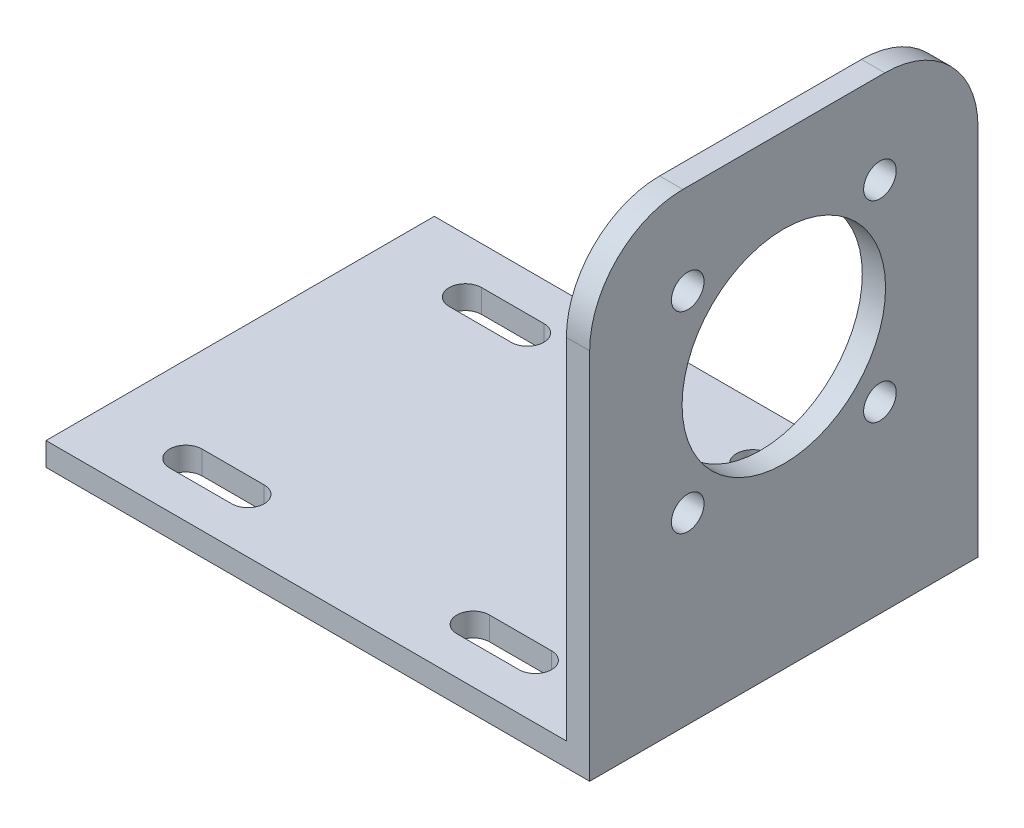
ISO-10303-21;
HEADER;
FILE_DESCRIPTION(('STEP AP214'),'2;1');
FILE_NAME('part.step','',(''),(''),'','','');
FILE_SCHEMA(('AUTOMOTIVE_DESIGN { 1 0 10303 214 1 1 1 1 }'));
ENDSEC;
DATA;
#1=APPLICATION_CONTEXT('core data for automotive mechanical design processes');
#2=APPLICATION_PROTOCOL_DEFINITION('international standard','automotive_design',2000,#1);
#3=PRODUCT_CONTEXT('',#1,'mechanical');
#4=PRODUCT('Part','Part','',(#3));
#5=PRODUCT_RELATED_PRODUCT_CATEGORY('part','',(#4));
#6=PRODUCT_DEFINITION_FORMATION('','',#4);
#7=PRODUCT_DEFINITION_CONTEXT('part definition',#1,'design');
#8=PRODUCT_DEFINITION('design','',#6,#7);
#9=PRODUCT_DEFINITION_SHAPE('','',#8);
#10=(LENGTH_UNIT() NAMED_UNIT(*) SI_UNIT(.MILLI.,.METRE.));
#11=(NAMED_UNIT(*) PLANE_ANGLE_UNIT() SI_UNIT($,.RADIAN.));
#12=(NAMED_UNIT(*) SI_UNIT($,.STERADIAN.) SOLID_ANGLE_UNIT());
#13=UNCERTAINTY_MEASURE_WITH_UNIT(LENGTH_MEASURE(1.E-05),#10,'distance_accuracy_value','');
#14=(GEOMETRIC_REPRESENTATION_CONTEXT(3) GLOBAL_UNCERTAINTY_ASSIGNED_CONTEXT((#13)) GLOBAL_UNIT_ASSIGNED_CONTEXT((#10,
#11,#12)) REPRESENTATION_CONTEXT('',''));
#15=CARTESIAN_POINT('',(0.,0.,0.));
#16=DIRECTION('',(0.,0.,1.));
#17=DIRECTION('',(1.,0.,0.));
#18=AXIS2_PLACEMENT_3D('',#15,#16,#17);
#19=CARTESIAN_POINT('',(0.,-3.,25.));
#20=DIRECTION('',(1.,0.,0.));
#21=DIRECTION('',(0.,0.,-1.));
#22=AXIS2_PLACEMENT_3D('',#19,#20,#21);
#23=PLANE('',#22);
#24=DIRECTION('',(0.,-1.,0.));
#25=VECTOR('',#24,1.);
#26=CARTESIAN_POINT('',(0.,-3.,-25.));
#27=LINE('',#26,#25);
#28=CARTESIAN_POINT('',(0.,0.,-25.));
#29=VERTEX_POINT('',#28);
#30=CARTESIAN_POINT('',(0.,-3.,-25.));
#31=VERTEX_POINT('',#30);
#32=EDGE_CURVE('E336',#29,#31,#27,.T.);
#33=ORIENTED_EDGE('',*,*,#32,.T.);
#34=DIRECTION('',(0.,0.,-1.));
#35=VECTOR('',#34,1.);
#36=CARTESIAN_POINT('',(0.,-3.,25.));
#37=LINE('',#36,#35);
#38=CARTESIAN_POINT('',(0.,-3.,25.));
#39=VERTEX_POINT('',#38);
#40=EDGE_CURVE('E373',#39,#31,#37,.T.);
#41=ORIENTED_EDGE('',*,*,#40,.F.);
#42=DIRECTION('',(0.,-1.,0.));
#43=VECTOR('',#42,1.);
#44=CARTESIAN_POINT('',(0.,-3.,25.));
#45=LINE('',#44,#43);
#46=CARTESIAN_POINT('',(0.,0.,25.));
#47=VERTEX_POINT('',#46);
#48=EDGE_CURVE('E337',#47,#39,#45,.T.);
#49=ORIENTED_EDGE('',*,*,#48,.F.);
#50=DIRECTION('',(0.,0.,-1.));
#51=VECTOR('',#50,1.);
#52=CARTESIAN_POINT('',(0.,0.,25.));
#53=LINE('',#52,#51);
#54=EDGE_CURVE('E349',#47,#29,#53,.T.);
#55=ORIENTED_EDGE('',*,*,#54,.T.);
#56=EDGE_LOOP('',(#33,#41,#49,#55));
#57=FACE_BOUND('',#56,.T.);
#58=ADVANCED_FACE('F35',(#57),#23,.F.);
#59=CARTESIAN_POINT('',(70.,-2.99999999999999,25.));
#60=DIRECTION('',(0.,1.,0.));
#61=DIRECTION('',(-1.,0.,0.));
#62=AXIS2_PLACEMENT_3D('',#59,#60,#61);
#63=PLANE('',#62);
#64=DIRECTION('',(1.,0.,0.));
#65=VECTOR('',#64,1.);
#66=CARTESIAN_POINT('',(48.,-2.99999999999999,-20.1));
#67=LINE('',#66,#65);
#68=CARTESIAN_POINT('',(48.,-2.99999999999999,-20.1));
#69=VERTEX_POINT('',#68);
#70=CARTESIAN_POINT('',(56.,-2.99999999999999,-20.1));
#71=VERTEX_POINT('',#70);
#72=EDGE_CURVE('E246',#69,#71,#67,.T.);
#73=ORIENTED_EDGE('',*,*,#72,.F.);
#74=CARTESIAN_POINT('',(48.,-2.99999999999999,-18.));
#75=DIRECTION('',(0.,1.,0.));
#76=DIRECTION('',(-1.,0.,0.));
#77=AXIS2_PLACEMENT_3D('',#74,#75,#76);
#78=CIRCLE('',#77,2.1);
#79=CARTESIAN_POINT('',(48.,-2.99999999999999,-15.9));
#80=VERTEX_POINT('',#79);
#81=EDGE_CURVE('E250',#80,#69,#78,.F.);
#82=ORIENTED_EDGE('',*,*,#81,.F.);
#83=DIRECTION('',(-1.,0.,0.));
#84=VECTOR('',#83,1.);
#85=CARTESIAN_POINT('',(48.,-2.99999999999999,-15.9));
#86=LINE('',#85,#84);
#87=CARTESIAN_POINT('',(56.,-2.99999999999999,-15.9));
#88=VERTEX_POINT('',#87);
#89=EDGE_CURVE('E267',#88,#80,#86,.T.);
#90=ORIENTED_EDGE('',*,*,#89,.F.);
#91=CARTESIAN_POINT('',(56.,-2.99999999999999,-18.));
#92=DIRECTION('',(0.,1.,0.));
#93=DIRECTION('',(-1.,0.,0.));
#94=AXIS2_PLACEMENT_3D('',#91,#92,#93);
#95=CIRCLE('',#94,2.1);
#96=EDGE_CURVE('E244',#71,#88,#95,.F.);
#97=ORIENTED_EDGE('',*,*,#96,.F.);
#98=EDGE_LOOP('',(#73,#82,#90,#97));
#99=FACE_BOUND('',#98,.T.);
#100=DIRECTION('',(1.,0.,0.));
#101=VECTOR('',#100,1.);
#102=CARTESIAN_POINT('',(11.,-3.,15.9));
#103=LINE('',#102,#101);
#104=CARTESIAN_POINT('',(11.,-3.,15.9));
#105=VERTEX_POINT('',#104);
#106=CARTESIAN_POINT('',(19.,-3.,15.9));
#107=VERTEX_POINT('',#106);
#108=EDGE_CURVE('E278',#105,#107,#103,.T.);
#109=ORIENTED_EDGE('',*,*,#108,.F.);
#110=CARTESIAN_POINT('',(11.,-3.,18.));
#111=DIRECTION('',(0.,1.,0.));
#112=DIRECTION('',(-1.,0.,0.));
#113=AXIS2_PLACEMENT_3D('',#110,#111,#112);
#114=CIRCLE('',#113,2.09999999999999);
#115=CARTESIAN_POINT('',(11.,-3.,20.1));
#116=VERTEX_POINT('',#115);
#117=EDGE_CURVE('E281',#116,#105,#114,.F.);
#118=ORIENTED_EDGE('',*,*,#117,.F.);
#119=DIRECTION('',(-1.,0.,0.));
#120=VECTOR('',#119,1.);
#121=CARTESIAN_POINT('',(11.,-3.,20.1));
#122=LINE('',#121,#120);
#123=CARTESIAN_POINT('',(19.,-3.,20.1));
#124=VERTEX_POINT('',#123);
#125=EDGE_CURVE('E247',#124,#116,#122,.T.);
#126=ORIENTED_EDGE('',*,*,#125,.F.);
#127=CARTESIAN_POINT('',(19.,-3.,18.));
#128=DIRECTION('',(0.,1.,0.));
#129=DIRECTION('',(-1.,0.,0.));
#130=AXIS2_PLACEMENT_3D('',#127,#128,#129);
#131=CIRCLE('',#130,2.09999999999999);
#132=EDGE_CURVE('E220',#107,#124,#131,.F.);
#133=ORIENTED_EDGE('',*,*,#132,.F.);
#134=EDGE_LOOP('',(#109,#118,#126,#133));
#135=FACE_BOUND('',#134,.T.);
#136=DIRECTION('',(1.,0.,0.));
#137=VECTOR('',#136,1.);
#138=CARTESIAN_POINT('',(48.,-2.99999999999999,15.9));
#139=LINE('',#138,#137);
#140=CARTESIAN_POINT('',(48.,-2.99999999999999,15.9));
#141=VERTEX_POINT('',#140);
#142=CARTESIAN_POINT('',(56.,-2.99999999999999,15.9));
#143=VERTEX_POINT('',#142);
#144=EDGE_CURVE('E226',#141,#143,#139,.T.);
#145=ORIENTED_EDGE('',*,*,#144,.F.);
#146=CARTESIAN_POINT('',(48.,-2.99999999999999,18.));
#147=DIRECTION('',(0.,1.,0.));
#148=DIRECTION('',(-1.,0.,0.));
#149=AXIS2_PLACEMENT_3D('',#146,#147,#148);
#150=CIRCLE('',#149,2.1);
#151=CARTESIAN_POINT('',(48.,-2.99999999999999,20.1));
#152=VERTEX_POINT('',#151);
#153=EDGE_CURVE('E204',#152,#141,#150,.F.);
#154=ORIENTED_EDGE('',*,*,#153,.F.);
#155=DIRECTION('',(-1.,0.,0.));
#156=VECTOR('',#155,1.);
#157=CARTESIAN_POINT('',(48.,-2.99999999999999,20.1));
#158=LINE('',#157,#156);
#159=CARTESIAN_POINT('',(56.,-2.99999999999999,20.1));
#160=VERTEX_POINT('',#159);
#161=EDGE_CURVE('E216',#160,#152,#158,.T.);
#162=ORIENTED_EDGE('',*,*,#161,.F.);
#163=CARTESIAN_POINT('',(56.,-2.99999999999999,18.));
#164=DIRECTION('',(0.,1.,0.));
#165=DIRECTION('',(-1.,0.,0.));
#166=AXIS2_PLACEMENT_3D('',#163,#164,#165);
#167=CIRCLE('',#166,2.1);
#168=EDGE_CURVE('E230',#143,#160,#167,.F.);
#169=ORIENTED_EDGE('',*,*,#168,.F.);
#170=EDGE_LOOP('',(#145,#154,#162,#169));
#171=FACE_BOUND('',#170,.T.);
#172=DIRECTION('',(1.,0.,0.));
#173=VECTOR('',#172,1.);
#174=CARTESIAN_POINT('',(11.,-3.,-20.1));
#175=LINE('',#174,#173);
#176=CARTESIAN_POINT('',(11.,-3.,-20.1));
#177=VERTEX_POINT('',#176);
#178=CARTESIAN_POINT('',(19.,-3.,-20.1));
#179=VERTEX_POINT('',#178);
#180=EDGE_CURVE('E307',#177,#179,#175,.T.);
#181=ORIENTED_EDGE('',*,*,#180,.F.);
#182=CARTESIAN_POINT('',(11.,-3.,-18.));
#183=DIRECTION('',(0.,1.,0.));
#184=DIRECTION('',(-1.,0.,0.));
#185=AXIS2_PLACEMENT_3D('',#182,#183,#184);
#186=CIRCLE('',#185,2.09999999999999);
#187=CARTESIAN_POINT('',(11.,-3.,-15.9));
#188=VERTEX_POINT('',#187);
#189=EDGE_CURVE('E310',#188,#177,#186,.F.);
#190=ORIENTED_EDGE('',*,*,#189,.F.);
#191=DIRECTION('',(-1.,0.,0.));
#192=VECTOR('',#191,1.);
#193=CARTESIAN_POINT('',(11.,-3.,-15.9));
#194=LINE('',#193,#192);
#195=CARTESIAN_POINT('',(19.,-3.,-15.9));
#196=VERTEX_POINT('',#195);
#197=EDGE_CURVE('E327',#196,#188,#194,.T.);
#198=ORIENTED_EDGE('',*,*,#197,.F.);
#199=CARTESIAN_POINT('',(19.,-3.,-18.));
#200=DIRECTION('',(0.,1.,0.));
#201=DIRECTION('',(-1.,0.,0.));
#202=AXIS2_PLACEMENT_3D('',#199,#200,#201);
#203=CIRCLE('',#202,2.09999999999999);
#204=EDGE_CURVE('E276',#179,#196,#203,.F.);
#205=ORIENTED_EDGE('',*,*,#204,.F.);
#206=EDGE_LOOP('',(#181,#190,#198,#205));
#207=FACE_BOUND('',#206,.T.);
#208=DIRECTION('',(1.,0.,0.));
#209=VECTOR('',#208,1.);
#210=CARTESIAN_POINT('',(70.,-2.99999999999999,-25.));
#211=LINE('',#210,#209);
#212=CARTESIAN_POINT('',(70.,-2.99999999999999,-25.));
#213=VERTEX_POINT('',#212);
#214=EDGE_CURVE('E352',#31,#213,#211,.T.);
#215=ORIENTED_EDGE('',*,*,#214,.T.);
#216=DIRECTION('',(0.,0.,-1.));
#217=VECTOR('',#216,1.);
#218=CARTESIAN_POINT('',(70.,-2.99999999999999,25.));
#219=LINE('',#218,#217);
#220=CARTESIAN_POINT('',(70.,-2.99999999999999,25.));
#221=VERTEX_POINT('',#220);
#222=EDGE_CURVE('E370',#221,#213,#219,.T.);
#223=ORIENTED_EDGE('',*,*,#222,.F.);
#224=DIRECTION('',(1.,0.,0.));
#225=VECTOR('',#224,1.);
#226=CARTESIAN_POINT('',(70.,-2.99999999999999,25.));
#227=LINE('',#226,#225);
#228=EDGE_CURVE('E340',#39,#221,#227,.T.);
#229=ORIENTED_EDGE('',*,*,#228,.F.);
#230=ORIENTED_EDGE('',*,*,#40,.T.);
#231=EDGE_LOOP('',(#215,#223,#229,#230));
#232=FACE_BOUND('',#231,.T.);
#233=ADVANCED_FACE('F223',(#99,#135,#171,#207,#232),#63,.F.);
#234=CARTESIAN_POINT('',(70.,57.,25.));
#235=DIRECTION('',(-1.,0.,0.));
#236=DIRECTION('',(0.,-1.,0.));
#237=AXIS2_PLACEMENT_3D('',#234,#235,#236);
#238=PLANE('',#237);
#239=CARTESIAN_POINT('',(70.,45.3743686707644,12.3743686707644));
#240=DIRECTION('',(-1.,0.,0.));
#241=DIRECTION('',(0.,-1.,0.));
#242=AXIS2_PLACEMENT_3D('',#239,#240,#241);
#243=CIRCLE('',#242,2.1);
#244=CARTESIAN_POINT('',(70.,43.2743686707644,12.3743686707644));
#245=VERTEX_POINT('',#244);
#246=EDGE_CURVE('E547',#245,#245,#243,.T.);
#247=ORIENTED_EDGE('',*,*,#246,.T.);
#248=EDGE_LOOP('',(#247));
#249=FACE_BOUND('',#248,.T.);
#250=CARTESIAN_POINT('',(70.,20.6256313292352,12.3743686707644));
#251=DIRECTION('',(-1.,0.,0.));
#252=DIRECTION('',(0.,-1.,0.));
#253=AXIS2_PLACEMENT_3D('',#250,#251,#252);
#254=CIRCLE('',#253,2.1);
#255=CARTESIAN_POINT('',(70.,18.5256313292352,12.3743686707644));
#256=VERTEX_POINT('',#255);
#257=EDGE_CURVE('E541',#256,#256,#254,.T.);
#258=ORIENTED_EDGE('',*,*,#257,.T.);
#259=EDGE_LOOP('',(#258));
#260=FACE_BOUND('',#259,.T.);
#261=CARTESIAN_POINT('',(70.,20.6256313292352,-12.3743686707648));
#262=DIRECTION('',(-1.,0.,0.));
#263=DIRECTION('',(0.,-1.,0.));
#264=AXIS2_PLACEMENT_3D('',#261,#262,#263);
#265=CIRCLE('',#264,2.1);
#266=CARTESIAN_POINT('',(70.,18.5256313292352,-12.3743686707648));
#267=VERTEX_POINT('',#266);
#268=EDGE_CURVE('E535',#267,#267,#265,.T.);
#269=ORIENTED_EDGE('',*,*,#268,.T.);
#270=EDGE_LOOP('',(#269));
#271=FACE_BOUND('',#270,.T.);
#272=CARTESIAN_POINT('',(70.,45.3743686707644,-12.3743686707647));
#273=DIRECTION('',(-1.,0.,0.));
#274=DIRECTION('',(0.,-1.,0.));
#275=AXIS2_PLACEMENT_3D('',#272,#273,#274);
#276=CIRCLE('',#275,2.1);
#277=CARTESIAN_POINT('',(70.,43.2743686707644,-12.3743686707647));
#278=VERTEX_POINT('',#277);
#279=EDGE_CURVE('E528',#278,#278,#276,.T.);
#280=ORIENTED_EDGE('',*,*,#279,.T.);
#281=EDGE_LOOP('',(#280));
#282=FACE_BOUND('',#281,.T.);
#283=CARTESIAN_POINT('',(70.,33.,0.));
#284=DIRECTION('',(-1.,0.,0.));
#285=DIRECTION('',(0.,-1.,0.));
#286=AXIS2_PLACEMENT_3D('',#283,#284,#285);
#287=CIRCLE('',#286,13.1);
#288=CARTESIAN_POINT('',(70.,19.9,0.));
#289=VERTEX_POINT('',#288);
#290=EDGE_CURVE('E533',#289,#289,#287,.T.);
#291=ORIENTED_EDGE('',*,*,#290,.T.);
#292=EDGE_LOOP('',(#291));
#293=FACE_BOUND('',#292,.T.);
#294=DIRECTION('',(0.,1.,0.));
#295=VECTOR('',#294,1.);
#296=CARTESIAN_POINT('',(70.,57.,-25.));
#297=LINE('',#296,#295);
#298=CARTESIAN_POINT('',(70.,45.,-25.));
#299=VERTEX_POINT('',#298);
#300=EDGE_CURVE('E354',#213,#299,#297,.T.);
#301=ORIENTED_EDGE('',*,*,#300,.T.);
#302=CARTESIAN_POINT('',(70.,45.,-13.));
#303=DIRECTION('',(-1.,0.,0.));
#304=DIRECTION('',(0.,-1.,0.));
#305=AXIS2_PLACEMENT_3D('',#302,#303,#304);
#306=CIRCLE('',#305,12.);
#307=CARTESIAN_POINT('',(70.,57.,-13.));
#308=VERTEX_POINT('',#307);
#309=EDGE_CURVE('E43',#299,#308,#306,.F.);
#310=ORIENTED_EDGE('',*,*,#309,.T.);
#311=DIRECTION('',(0.,0.,-1.));
#312=VECTOR('',#311,1.);
#313=CARTESIAN_POINT('',(70.,57.,25.));
#314=LINE('',#313,#312);
#315=CARTESIAN_POINT('',(70.,57.,13.));
#316=VERTEX_POINT('',#315);
#317=EDGE_CURVE('E367',#316,#308,#314,.T.);
#318=ORIENTED_EDGE('',*,*,#317,.F.);
#319=CARTESIAN_POINT('',(70.,45.,13.));
#320=DIRECTION('',(-1.,0.,0.));
#321=DIRECTION('',(0.,-1.,0.));
#322=AXIS2_PLACEMENT_3D('',#319,#320,#321);
#323=CIRCLE('',#322,12.);
#324=CARTESIAN_POINT('',(70.,45.,25.));
#325=VERTEX_POINT('',#324);
#326=EDGE_CURVE('E50',#316,#325,#323,.F.);
#327=ORIENTED_EDGE('',*,*,#326,.T.);
#328=DIRECTION('',(0.,1.,0.));
#329=VECTOR('',#328,1.);
#330=CARTESIAN_POINT('',(70.,57.,25.));
#331=LINE('',#330,#329);
#332=EDGE_CURVE('E343',#221,#325,#331,.T.);
#333=ORIENTED_EDGE('',*,*,#332,.F.);
#334=ORIENTED_EDGE('',*,*,#222,.T.);
#335=EDGE_LOOP('',(#301,#310,#318,#327,#333,#334));
#336=FACE_BOUND('',#335,.T.);
#337=ADVANCED_FACE('F387',(#249,#260,#271,#282,#293,#336),#238,.F.);
#338=CARTESIAN_POINT('',(67.,57.,25.));
#339=DIRECTION('',(0.,-1.,0.));
#340=DIRECTION('',(0.,0.,-1.));
#341=AXIS2_PLACEMENT_3D('',#338,#339,#340);
#342=PLANE('',#341);
#343=ORIENTED_EDGE('',*,*,#317,.T.);
#344=DIRECTION('',(-1.,0.,0.));
#345=VECTOR('',#344,1.);
#346=CARTESIAN_POINT('',(67.,57.,-13.));
#347=LINE('',#346,#345);
#348=CARTESIAN_POINT('',(67.,57.,-13.));
#349=VERTEX_POINT('',#348);
#350=EDGE_CURVE('E378',#308,#349,#347,.T.);
#351=ORIENTED_EDGE('',*,*,#350,.T.);
#352=DIRECTION('',(0.,0.,-1.));
#353=VECTOR('',#352,1.);
#354=CARTESIAN_POINT('',(67.,57.,25.));
#355=LINE('',#354,#353);
#356=CARTESIAN_POINT('',(67.,57.,13.));
#357=VERTEX_POINT('',#356);
#358=EDGE_CURVE('E364',#357,#349,#355,.T.);
#359=ORIENTED_EDGE('',*,*,#358,.F.);
#360=DIRECTION('',(-1.,0.,0.));
#361=VECTOR('',#360,1.);
#362=CARTESIAN_POINT('',(67.,57.,13.));
#363=LINE('',#362,#361);
#364=EDGE_CURVE('E376',#357,#316,#363,.F.);
#365=ORIENTED_EDGE('',*,*,#364,.T.);
#366=EDGE_LOOP('',(#343,#351,#359,#365));
#367=FACE_BOUND('',#366,.T.);
#368=ADVANCED_FACE('F391',(#367),#342,.F.);
#369=CARTESIAN_POINT('',(67.,0.,25.));
#370=DIRECTION('',(1.,0.,0.));
#371=DIRECTION('',(0.,0.,-1.));
#372=AXIS2_PLACEMENT_3D('',#369,#370,#371);
#373=PLANE('',#372);
#374=CARTESIAN_POINT('',(67.,45.3743686707644,12.3743686707644));
#375=DIRECTION('',(1.,0.,0.));
#376=DIRECTION('',(0.,0.,-1.));
#377=AXIS2_PLACEMENT_3D('',#374,#375,#376);
#378=CIRCLE('',#377,2.1);
#379=CARTESIAN_POINT('',(67.,45.3743686707644,10.2743686707644));
#380=VERTEX_POINT('',#379);
#381=EDGE_CURVE('E550',#380,#380,#378,.T.);
#382=ORIENTED_EDGE('',*,*,#381,.T.);
#383=EDGE_LOOP('',(#382));
#384=FACE_BOUND('',#383,.T.);
#385=CARTESIAN_POINT('',(67.,20.6256313292352,12.3743686707644));
#386=DIRECTION('',(1.,0.,0.));
#387=DIRECTION('',(0.,0.,-1.));
#388=AXIS2_PLACEMENT_3D('',#385,#386,#387);
#389=CIRCLE('',#388,2.1);
#390=CARTESIAN_POINT('',(67.,20.6256313292352,10.2743686707644));
#391=VERTEX_POINT('',#390);
#392=EDGE_CURVE('E544',#391,#391,#389,.T.);
#393=ORIENTED_EDGE('',*,*,#392,.T.);
#394=EDGE_LOOP('',(#393));
#395=FACE_BOUND('',#394,.T.);
#396=CARTESIAN_POINT('',(67.,20.6256313292352,-12.3743686707648));
#397=DIRECTION('',(1.,0.,0.));
#398=DIRECTION('',(0.,0.,-1.));
#399=AXIS2_PLACEMENT_3D('',#396,#397,#398);
#400=CIRCLE('',#399,2.1);
#401=CARTESIAN_POINT('',(67.,20.6256313292352,-14.4743686707648));
#402=VERTEX_POINT('',#401);
#403=EDGE_CURVE('E538',#402,#402,#400,.T.);
#404=ORIENTED_EDGE('',*,*,#403,.T.);
#405=EDGE_LOOP('',(#404));
#406=FACE_BOUND('',#405,.T.);
#407=CARTESIAN_POINT('',(67.,45.3743686707644,-12.3743686707647));
#408=DIRECTION('',(1.,0.,0.));
#409=DIRECTION('',(0.,0.,-1.));
#410=AXIS2_PLACEMENT_3D('',#407,#408,#409);
#411=CIRCLE('',#410,2.1);
#412=CARTESIAN_POINT('',(67.,45.3743686707644,-14.4743686707647));
#413=VERTEX_POINT('',#412);
#414=EDGE_CURVE('E525',#413,#413,#411,.T.);
#415=ORIENTED_EDGE('',*,*,#414,.T.);
#416=EDGE_LOOP('',(#415));
#417=FACE_BOUND('',#416,.T.);
#418=CARTESIAN_POINT('',(67.,33.,0.));
#419=DIRECTION('',(1.,0.,0.));
#420=DIRECTION('',(0.,0.,-1.));
#421=AXIS2_PLACEMENT_3D('',#418,#419,#420);
#422=CIRCLE('',#421,13.1);
#423=CARTESIAN_POINT('',(67.,33.,-13.1));
#424=VERTEX_POINT('',#423);
#425=EDGE_CURVE('E530',#424,#424,#422,.T.);
#426=ORIENTED_EDGE('',*,*,#425,.T.);
#427=EDGE_LOOP('',(#426));
#428=FACE_BOUND('',#427,.T.);
#429=ORIENTED_EDGE('',*,*,#358,.T.);
#430=CARTESIAN_POINT('',(67.,45.,-13.));
#431=DIRECTION('',(1.,0.,0.));
#432=DIRECTION('',(0.,0.,-1.));
#433=AXIS2_PLACEMENT_3D('',#430,#431,#432);
#434=CIRCLE('',#433,12.);
#435=CARTESIAN_POINT('',(67.,45.,-25.));
#436=VERTEX_POINT('',#435);
#437=EDGE_CURVE('E383',#349,#436,#434,.F.);
#438=ORIENTED_EDGE('',*,*,#437,.T.);
#439=DIRECTION('',(0.,-1.,0.));
#440=VECTOR('',#439,1.);
#441=CARTESIAN_POINT('',(67.,0.,-25.));
#442=LINE('',#441,#440);
#443=CARTESIAN_POINT('',(67.,0.,-25.));
#444=VERTEX_POINT('',#443);
#445=EDGE_CURVE('E356',#436,#444,#442,.T.);
#446=ORIENTED_EDGE('',*,*,#445,.T.);
#447=DIRECTION('',(0.,0.,-1.));
#448=VECTOR('',#447,1.);
#449=CARTESIAN_POINT('',(67.,0.,25.));
#450=LINE('',#449,#448);
#451=CARTESIAN_POINT('',(67.,0.,25.));
#452=VERTEX_POINT('',#451);
#453=EDGE_CURVE('E361',#452,#444,#450,.T.);
#454=ORIENTED_EDGE('',*,*,#453,.F.);
#455=DIRECTION('',(0.,-1.,0.));
#456=VECTOR('',#455,1.);
#457=CARTESIAN_POINT('',(67.,0.,25.));
#458=LINE('',#457,#456);
#459=CARTESIAN_POINT('',(67.,45.,25.));
#460=VERTEX_POINT('',#459);
#461=EDGE_CURVE('E345',#460,#452,#458,.T.);
#462=ORIENTED_EDGE('',*,*,#461,.F.);
#463=CARTESIAN_POINT('',(67.,45.,13.));
#464=DIRECTION('',(1.,0.,0.));
#465=DIRECTION('',(0.,0.,-1.));
#466=AXIS2_PLACEMENT_3D('',#463,#464,#465);
#467=CIRCLE('',#466,12.);
#468=EDGE_CURVE('E381',#460,#357,#467,.F.);
#469=ORIENTED_EDGE('',*,*,#468,.T.);
#470=EDGE_LOOP('',(#429,#438,#446,#454,#462,#469));
#471=FACE_BOUND('',#470,.T.);
#472=ADVANCED_FACE('F396',(#384,#395,#406,#417,#428,#471),#373,.F.);
#473=CARTESIAN_POINT('',(0.,0.,25.));
#474=DIRECTION('',(0.,-1.,0.));
#475=DIRECTION('',(0.,0.,-1.));
#476=AXIS2_PLACEMENT_3D('',#473,#474,#475);
#477=PLANE('',#476);
#478=DIRECTION('',(1.,0.,0.));
#479=VECTOR('',#478,1.);
#480=CARTESIAN_POINT('',(48.,0.,-15.9));
#481=LINE('',#480,#479);
#482=CARTESIAN_POINT('',(48.,0.,-15.9));
#483=VERTEX_POINT('',#482);
#484=CARTESIAN_POINT('',(56.,0.,-15.9));
#485=VERTEX_POINT('',#484);
#486=EDGE_CURVE('E255',#483,#485,#481,.T.);
#487=ORIENTED_EDGE('',*,*,#486,.F.);
#488=CARTESIAN_POINT('',(48.,0.,-18.));
#489=DIRECTION('',(0.,1.,0.));
#490=DIRECTION('',(0.,0.,1.));
#491=AXIS2_PLACEMENT_3D('',#488,#489,#490);
#492=CIRCLE('',#491,2.1);
#493=CARTESIAN_POINT('',(48.,0.,-20.1));
#494=VERTEX_POINT('',#493);
#495=EDGE_CURVE('E253',#494,#483,#492,.T.);
#496=ORIENTED_EDGE('',*,*,#495,.F.);
#497=DIRECTION('',(-1.,0.,0.));
#498=VECTOR('',#497,1.);
#499=CARTESIAN_POINT('',(48.,0.,-20.1));
#500=LINE('',#499,#498);
#501=CARTESIAN_POINT('',(56.,0.,-20.1));
#502=VERTEX_POINT('',#501);
#503=EDGE_CURVE('E261',#502,#494,#500,.T.);
#504=ORIENTED_EDGE('',*,*,#503,.F.);
#505=CARTESIAN_POINT('',(56.,0.,-18.));
#506=DIRECTION('',(0.,1.,0.));
#507=DIRECTION('',(0.,0.,1.));
#508=AXIS2_PLACEMENT_3D('',#505,#506,#507);
#509=CIRCLE('',#508,2.1);
#510=EDGE_CURVE('E258',#485,#502,#509,.T.);
#511=ORIENTED_EDGE('',*,*,#510,.F.);
#512=EDGE_LOOP('',(#487,#496,#504,#511));
#513=FACE_BOUND('',#512,.T.);
#514=DIRECTION('',(1.,0.,0.));
#515=VECTOR('',#514,1.);
#516=CARTESIAN_POINT('',(11.,0.,20.1));
#517=LINE('',#516,#515);
#518=CARTESIAN_POINT('',(11.,0.,20.1));
#519=VERTEX_POINT('',#518);
#520=CARTESIAN_POINT('',(19.,0.,20.1));
#521=VERTEX_POINT('',#520);
#522=EDGE_CURVE('E286',#519,#521,#517,.T.);
#523=ORIENTED_EDGE('',*,*,#522,.F.);
#524=CARTESIAN_POINT('',(11.,0.,18.));
#525=DIRECTION('',(0.,1.,0.));
#526=DIRECTION('',(0.,0.,-1.));
#527=AXIS2_PLACEMENT_3D('',#524,#525,#526);
#528=CIRCLE('',#527,2.09999999999999);
#529=CARTESIAN_POINT('',(11.,0.,15.9));
#530=VERTEX_POINT('',#529);
#531=EDGE_CURVE('E284',#530,#519,#528,.T.);
#532=ORIENTED_EDGE('',*,*,#531,.F.);
#533=DIRECTION('',(-1.,0.,0.));
#534=VECTOR('',#533,1.);
#535=CARTESIAN_POINT('',(11.,0.,15.9));
#536=LINE('',#535,#534);
#537=CARTESIAN_POINT('',(19.,0.,15.9));
#538=VERTEX_POINT('',#537);
#539=EDGE_CURVE('E292',#538,#530,#536,.T.);
#540=ORIENTED_EDGE('',*,*,#539,.F.);
#541=CARTESIAN_POINT('',(19.,0.,18.));
#542=DIRECTION('',(0.,1.,0.));
#543=DIRECTION('',(0.,0.,-1.));
#544=AXIS2_PLACEMENT_3D('',#541,#542,#543);
#545=CIRCLE('',#544,2.09999999999999);
#546=EDGE_CURVE('E289',#521,#538,#545,.T.);
#547=ORIENTED_EDGE('',*,*,#546,.F.);
#548=EDGE_LOOP('',(#523,#532,#540,#547));
#549=FACE_BOUND('',#548,.T.);
#550=DIRECTION('',(1.,0.,0.));
#551=VECTOR('',#550,1.);
#552=CARTESIAN_POINT('',(48.,0.,20.1));
#553=LINE('',#552,#551);
#554=CARTESIAN_POINT('',(48.,0.,20.1));
#555=VERTEX_POINT('',#554);
#556=CARTESIAN_POINT('',(56.,0.,20.1));
#557=VERTEX_POINT('',#556);
#558=EDGE_CURVE('E228',#555,#557,#553,.T.);
#559=ORIENTED_EDGE('',*,*,#558,.F.);
#560=CARTESIAN_POINT('',(48.,0.,18.));
#561=DIRECTION('',(0.,1.,0.));
#562=DIRECTION('',(0.,0.,-1.));
#563=AXIS2_PLACEMENT_3D('',#560,#561,#562);
#564=CIRCLE('',#563,2.1);
#565=CARTESIAN_POINT('',(48.,0.,15.9));
#566=VERTEX_POINT('',#565);
#567=EDGE_CURVE('E207',#566,#555,#564,.T.);
#568=ORIENTED_EDGE('',*,*,#567,.F.);
#569=DIRECTION('',(-1.,0.,0.));
#570=VECTOR('',#569,1.);
#571=CARTESIAN_POINT('',(48.,0.,15.9));
#572=LINE('',#571,#570);
#573=CARTESIAN_POINT('',(56.,0.,15.9));
#574=VERTEX_POINT('',#573);
#575=EDGE_CURVE('E212',#574,#566,#572,.T.);
#576=ORIENTED_EDGE('',*,*,#575,.F.);
#577=CARTESIAN_POINT('',(56.,0.,18.));
#578=DIRECTION('',(0.,1.,0.));
#579=DIRECTION('',(0.,0.,-1.));
#580=AXIS2_PLACEMENT_3D('',#577,#578,#579);
#581=CIRCLE('',#580,2.1);
#582=EDGE_CURVE('E235',#557,#574,#581,.T.);
#583=ORIENTED_EDGE('',*,*,#582,.F.);
#584=EDGE_LOOP('',(#559,#568,#576,#583));
#585=FACE_BOUND('',#584,.T.);
#586=DIRECTION('',(1.,0.,0.));
#587=VECTOR('',#586,1.);
#588=CARTESIAN_POINT('',(11.,0.,-15.9));
#589=LINE('',#588,#587);
#590=CARTESIAN_POINT('',(11.,0.,-15.9));
#591=VERTEX_POINT('',#590);
#592=CARTESIAN_POINT('',(19.,0.,-15.9));
#593=VERTEX_POINT('',#592);
#594=EDGE_CURVE('E315',#591,#593,#589,.T.);
#595=ORIENTED_EDGE('',*,*,#594,.F.);
#596=CARTESIAN_POINT('',(11.,0.,-18.));
#597=DIRECTION('',(0.,1.,0.));
#598=DIRECTION('',(0.,0.,1.));
#599=AXIS2_PLACEMENT_3D('',#596,#597,#598);
#600=CIRCLE('',#599,2.09999999999999);
#601=CARTESIAN_POINT('',(11.,0.,-20.1));
#602=VERTEX_POINT('',#601);
#603=EDGE_CURVE('E313',#602,#591,#600,.T.);
#604=ORIENTED_EDGE('',*,*,#603,.F.);
#605=DIRECTION('',(-1.,0.,0.));
#606=VECTOR('',#605,1.);
#607=CARTESIAN_POINT('',(11.,0.,-20.1));
#608=LINE('',#607,#606);
#609=CARTESIAN_POINT('',(19.,0.,-20.1));
#610=VERTEX_POINT('',#609);
#611=EDGE_CURVE('E321',#610,#602,#608,.T.);
#612=ORIENTED_EDGE('',*,*,#611,.F.);
#613=CARTESIAN_POINT('',(19.,0.,-18.));
#614=DIRECTION('',(0.,1.,0.));
#615=DIRECTION('',(0.,0.,1.));
#616=AXIS2_PLACEMENT_3D('',#613,#614,#615);
#617=CIRCLE('',#616,2.09999999999999);
#618=EDGE_CURVE('E318',#593,#610,#617,.T.);
#619=ORIENTED_EDGE('',*,*,#618,.F.);
#620=EDGE_LOOP('',(#595,#604,#612,#619));
#621=FACE_BOUND('',#620,.T.);
#622=DIRECTION('',(-1.,0.,0.));
#623=VECTOR('',#622,1.);
#624=CARTESIAN_POINT('',(0.,0.,-25.));
#625=LINE('',#624,#623);
#626=EDGE_CURVE('E341',#444,#29,#625,.T.);
#627=ORIENTED_EDGE('',*,*,#626,.T.);
#628=ORIENTED_EDGE('',*,*,#54,.F.);
#629=DIRECTION('',(-1.,0.,0.));
#630=VECTOR('',#629,1.);
#631=CARTESIAN_POINT('',(0.,0.,25.));
#632=LINE('',#631,#630);
#633=EDGE_CURVE('E347',#452,#47,#632,.T.);
#634=ORIENTED_EDGE('',*,*,#633,.F.);
#635=ORIENTED_EDGE('',*,*,#453,.T.);
#636=EDGE_LOOP('',(#627,#628,#634,#635));
#637=FACE_BOUND('',#636,.T.);
#638=ADVANCED_FACE('F403',(#513,#549,#585,#621,#637),#477,.F.);
#639=CARTESIAN_POINT('',(0.,0.,25.));
#640=DIRECTION('',(0.,0.,-1.));
#641=DIRECTION('',(-1.,0.,0.));
#642=AXIS2_PLACEMENT_3D('',#639,#640,#641);
#643=PLANE('',#642);
#644=ORIENTED_EDGE('',*,*,#332,.T.);
#645=DIRECTION('',(-1.,0.,0.));
#646=VECTOR('',#645,1.);
#647=CARTESIAN_POINT('',(0.,45.,25.));
#648=LINE('',#647,#646);
#649=EDGE_CURVE('E11',#325,#460,#648,.T.);
#650=ORIENTED_EDGE('',*,*,#649,.T.);
#651=ORIENTED_EDGE('',*,*,#461,.T.);
#652=ORIENTED_EDGE('',*,*,#633,.T.);
#653=ORIENTED_EDGE('',*,*,#48,.T.);
#654=ORIENTED_EDGE('',*,*,#228,.T.);
#655=EDGE_LOOP('',(#644,#650,#651,#652,#653,#654));
#656=FACE_BOUND('',#655,.T.);
#657=ADVANCED_FACE('F409',(#656),#643,.F.);
#658=CARTESIAN_POINT('',(0.,0.,-25.));
#659=DIRECTION('',(0.,0.,-1.));
#660=DIRECTION('',(-1.,0.,0.));
#661=AXIS2_PLACEMENT_3D('',#658,#659,#660);
#662=PLANE('',#661);
#663=ORIENTED_EDGE('',*,*,#445,.F.);
#664=DIRECTION('',(-1.,0.,0.));
#665=VECTOR('',#664,1.);
#666=CARTESIAN_POINT('',(70.,45.,-25.));
#667=LINE('',#666,#665);
#668=EDGE_CURVE('E58',#436,#299,#667,.F.);
#669=ORIENTED_EDGE('',*,*,#668,.T.);
#670=ORIENTED_EDGE('',*,*,#300,.F.);
#671=ORIENTED_EDGE('',*,*,#214,.F.);
#672=ORIENTED_EDGE('',*,*,#32,.F.);
#673=ORIENTED_EDGE('',*,*,#626,.F.);
#674=EDGE_LOOP('',(#663,#669,#670,#671,#672,#673));
#675=FACE_BOUND('',#674,.T.);
#676=ADVANCED_FACE('F399',(#675),#662,.T.);
#677=CARTESIAN_POINT('',(11.,-3.001,-18.));
#678=DIRECTION('',(0.,1.,0.));
#679=DIRECTION('',(0.,0.,1.));
#680=AXIS2_PLACEMENT_3D('',#677,#678,#679);
#681=CYLINDRICAL_SURFACE('',#680,2.09999999999999);
#682=ORIENTED_EDGE('',*,*,#189,.T.);
#683=DIRECTION('',(0.,1.,0.));
#684=VECTOR('',#683,1.);
#685=CARTESIAN_POINT('',(11.,-3.001,-20.1));
#686=LINE('',#685,#684);
#687=EDGE_CURVE('E325',#177,#602,#686,.T.);
#688=ORIENTED_EDGE('',*,*,#687,.T.);
#689=ORIENTED_EDGE('',*,*,#603,.T.);
#690=DIRECTION('',(0.,1.,0.));
#691=VECTOR('',#690,1.);
#692=CARTESIAN_POINT('',(11.,-3.001,-15.9));
#693=LINE('',#692,#691);
#694=EDGE_CURVE('E324',#188,#591,#693,.T.);
#695=ORIENTED_EDGE('',*,*,#694,.F.);
#696=EDGE_LOOP('',(#682,#688,#689,#695));
#697=FACE_BOUND('',#696,.T.);
#698=ADVANCED_FACE('F440',(#697),#681,.F.);
#699=CARTESIAN_POINT('',(11.,-3.001,-20.1));
#700=DIRECTION('',(0.,0.,-1.));
#701=DIRECTION('',(-1.,0.,0.));
#702=AXIS2_PLACEMENT_3D('',#699,#700,#701);
#703=PLANE('',#702);
#704=ORIENTED_EDGE('',*,*,#180,.T.);
#705=DIRECTION('',(0.,1.,0.));
#706=VECTOR('',#705,1.);
#707=CARTESIAN_POINT('',(19.,-3.001,-20.1));
#708=LINE('',#707,#706);
#709=EDGE_CURVE('E328',#179,#610,#708,.T.);
#710=ORIENTED_EDGE('',*,*,#709,.T.);
#711=ORIENTED_EDGE('',*,*,#611,.T.);
#712=ORIENTED_EDGE('',*,*,#687,.F.);
#713=EDGE_LOOP('',(#704,#710,#711,#712));
#714=FACE_BOUND('',#713,.T.);
#715=ADVANCED_FACE('F445',(#714),#703,.F.);
#716=CARTESIAN_POINT('',(19.,-3.001,-18.));
#717=DIRECTION('',(0.,1.,0.));
#718=DIRECTION('',(0.,0.,1.));
#719=AXIS2_PLACEMENT_3D('',#716,#717,#718);
#720=CYLINDRICAL_SURFACE('',#719,2.09999999999999);
#721=ORIENTED_EDGE('',*,*,#204,.T.);
#722=DIRECTION('',(0.,1.,0.));
#723=VECTOR('',#722,1.);
#724=CARTESIAN_POINT('',(19.,-3.001,-15.9));
#725=LINE('',#724,#723);
#726=EDGE_CURVE('E330',#196,#593,#725,.T.);
#727=ORIENTED_EDGE('',*,*,#726,.T.);
#728=ORIENTED_EDGE('',*,*,#618,.T.);
#729=ORIENTED_EDGE('',*,*,#709,.F.);
#730=EDGE_LOOP('',(#721,#727,#728,#729));
#731=FACE_BOUND('',#730,.T.);
#732=ADVANCED_FACE('F450',(#731),#720,.F.);
#733=CARTESIAN_POINT('',(11.,-3.001,-15.9));
#734=DIRECTION('',(0.,0.,1.));
#735=DIRECTION('',(1.,0.,0.));
#736=AXIS2_PLACEMENT_3D('',#733,#734,#735);
#737=PLANE('',#736);
#738=ORIENTED_EDGE('',*,*,#197,.T.);
#739=ORIENTED_EDGE('',*,*,#694,.T.);
#740=ORIENTED_EDGE('',*,*,#594,.T.);
#741=ORIENTED_EDGE('',*,*,#726,.F.);
#742=EDGE_LOOP('',(#738,#739,#740,#741));
#743=FACE_BOUND('',#742,.T.);
#744=ADVANCED_FACE('F447',(#743),#737,.F.);
#745=CARTESIAN_POINT('',(48.,-3.001,18.));
#746=DIRECTION('',(0.,1.,0.));
#747=DIRECTION('',(0.,0.,1.));
#748=AXIS2_PLACEMENT_3D('',#745,#746,#747);
#749=CYLINDRICAL_SURFACE('',#748,2.1);
#750=ORIENTED_EDGE('',*,*,#153,.T.);
#751=DIRECTION('',(0.,1.,0.));
#752=VECTOR('',#751,1.);
#753=CARTESIAN_POINT('',(48.,-3.001,15.9));
#754=LINE('',#753,#752);
#755=EDGE_CURVE('E221',#141,#566,#754,.T.);
#756=ORIENTED_EDGE('',*,*,#755,.T.);
#757=ORIENTED_EDGE('',*,*,#567,.T.);
#758=DIRECTION('',(0.,1.,0.));
#759=VECTOR('',#758,1.);
#760=CARTESIAN_POINT('',(48.,-3.001,20.1));
#761=LINE('',#760,#759);
#762=EDGE_CURVE('E200',#152,#555,#761,.T.);
#763=ORIENTED_EDGE('',*,*,#762,.F.);
#764=EDGE_LOOP('',(#750,#756,#757,#763));
#765=FACE_BOUND('',#764,.T.);
#766=ADVANCED_FACE('F202',(#765),#749,.F.);
#767=CARTESIAN_POINT('',(48.,-3.001,15.9));
#768=DIRECTION('',(0.,0.,-1.));
#769=DIRECTION('',(-1.,0.,0.));
#770=AXIS2_PLACEMENT_3D('',#767,#768,#769);
#771=PLANE('',#770);
#772=ORIENTED_EDGE('',*,*,#144,.T.);
#773=DIRECTION('',(0.,1.,0.));
#774=VECTOR('',#773,1.);
#775=CARTESIAN_POINT('',(56.,-3.001,15.9));
#776=LINE('',#775,#774);
#777=EDGE_CURVE('E241',#143,#574,#776,.T.);
#778=ORIENTED_EDGE('',*,*,#777,.T.);
#779=ORIENTED_EDGE('',*,*,#575,.T.);
#780=ORIENTED_EDGE('',*,*,#755,.F.);
#781=EDGE_LOOP('',(#772,#778,#779,#780));
#782=FACE_BOUND('',#781,.T.);
#783=ADVANCED_FACE('F493',(#782),#771,.F.);
#784=CARTESIAN_POINT('',(56.,-3.001,18.));
#785=DIRECTION('',(0.,1.,0.));
#786=DIRECTION('',(0.,0.,1.));
#787=AXIS2_PLACEMENT_3D('',#784,#785,#786);
#788=CYLINDRICAL_SURFACE('',#787,2.1);
#789=ORIENTED_EDGE('',*,*,#168,.T.);
#790=DIRECTION('',(0.,1.,0.));
#791=VECTOR('',#790,1.);
#792=CARTESIAN_POINT('',(56.,-3.001,20.1));
#793=LINE('',#792,#791);
#794=EDGE_CURVE('E211',#160,#557,#793,.T.);
#795=ORIENTED_EDGE('',*,*,#794,.T.);
#796=ORIENTED_EDGE('',*,*,#582,.T.);
#797=ORIENTED_EDGE('',*,*,#777,.F.);
#798=EDGE_LOOP('',(#789,#795,#796,#797));
#799=FACE_BOUND('',#798,.T.);
#800=ADVANCED_FACE('F496',(#799),#788,.F.);
#801=CARTESIAN_POINT('',(48.,-3.001,20.1));
#802=DIRECTION('',(0.,0.,1.));
#803=DIRECTION('',(1.,0.,0.));
#804=AXIS2_PLACEMENT_3D('',#801,#802,#803);
#805=PLANE('',#804);
#806=ORIENTED_EDGE('',*,*,#161,.T.);
#807=ORIENTED_EDGE('',*,*,#762,.T.);
#808=ORIENTED_EDGE('',*,*,#558,.T.);
#809=ORIENTED_EDGE('',*,*,#794,.F.);
#810=EDGE_LOOP('',(#806,#807,#808,#809));
#811=FACE_BOUND('',#810,.T.);
#812=ADVANCED_FACE('F217',(#811),#805,.F.);
#813=CARTESIAN_POINT('',(11.,-3.001,18.));
#814=DIRECTION('',(0.,1.,0.));
#815=DIRECTION('',(0.,0.,1.));
#816=AXIS2_PLACEMENT_3D('',#813,#814,#815);
#817=CYLINDRICAL_SURFACE('',#816,2.09999999999999);
#818=ORIENTED_EDGE('',*,*,#117,.T.);
#819=DIRECTION('',(0.,1.,0.));
#820=VECTOR('',#819,1.);
#821=CARTESIAN_POINT('',(11.,-3.001,15.9));
#822=LINE('',#821,#820);
#823=EDGE_CURVE('E296',#105,#530,#822,.T.);
#824=ORIENTED_EDGE('',*,*,#823,.T.);
#825=ORIENTED_EDGE('',*,*,#531,.T.);
#826=DIRECTION('',(0.,1.,0.));
#827=VECTOR('',#826,1.);
#828=CARTESIAN_POINT('',(11.,-3.001,20.1));
#829=LINE('',#828,#827);
#830=EDGE_CURVE('E295',#116,#519,#829,.T.);
#831=ORIENTED_EDGE('',*,*,#830,.F.);
#832=EDGE_LOOP('',(#818,#824,#825,#831));
#833=FACE_BOUND('',#832,.T.);
#834=ADVANCED_FACE('F458',(#833),#817,.F.);
#835=CARTESIAN_POINT('',(11.,-3.001,15.9));
#836=DIRECTION('',(0.,0.,-1.));
#837=DIRECTION('',(-1.,0.,0.));
#838=AXIS2_PLACEMENT_3D('',#835,#836,#837);
#839=PLANE('',#838);
#840=ORIENTED_EDGE('',*,*,#108,.T.);
#841=DIRECTION('',(0.,1.,0.));
#842=VECTOR('',#841,1.);
#843=CARTESIAN_POINT('',(19.,-3.001,15.9));
#844=LINE('',#843,#842);
#845=EDGE_CURVE('E298',#107,#538,#844,.T.);
#846=ORIENTED_EDGE('',*,*,#845,.T.);
#847=ORIENTED_EDGE('',*,*,#539,.T.);
#848=ORIENTED_EDGE('',*,*,#823,.F.);
#849=EDGE_LOOP('',(#840,#846,#847,#848));
#850=FACE_BOUND('',#849,.T.);
#851=ADVANCED_FACE('F461',(#850),#839,.F.);
#852=CARTESIAN_POINT('',(19.,-3.001,18.));
#853=DIRECTION('',(0.,1.,0.));
#854=DIRECTION('',(0.,0.,1.));
#855=AXIS2_PLACEMENT_3D('',#852,#853,#854);
#856=CYLINDRICAL_SURFACE('',#855,2.09999999999999);
#857=ORIENTED_EDGE('',*,*,#132,.T.);
#858=DIRECTION('',(0.,1.,0.));
#859=VECTOR('',#858,1.);
#860=CARTESIAN_POINT('',(19.,-3.001,20.1));
#861=LINE('',#860,#859);
#862=EDGE_CURVE('E300',#124,#521,#861,.T.);
#863=ORIENTED_EDGE('',*,*,#862,.T.);
#864=ORIENTED_EDGE('',*,*,#546,.T.);
#865=ORIENTED_EDGE('',*,*,#845,.F.);
#866=EDGE_LOOP('',(#857,#863,#864,#865));
#867=FACE_BOUND('',#866,.T.);
#868=ADVANCED_FACE('F467',(#867),#856,.F.);
#869=CARTESIAN_POINT('',(11.,-3.001,20.1));
#870=DIRECTION('',(0.,0.,1.));
#871=DIRECTION('',(1.,0.,0.));
#872=AXIS2_PLACEMENT_3D('',#869,#870,#871);
#873=PLANE('',#872);
#874=ORIENTED_EDGE('',*,*,#125,.T.);
#875=ORIENTED_EDGE('',*,*,#830,.T.);
#876=ORIENTED_EDGE('',*,*,#522,.T.);
#877=ORIENTED_EDGE('',*,*,#862,.F.);
#878=EDGE_LOOP('',(#874,#875,#876,#877));
#879=FACE_BOUND('',#878,.T.);
#880=ADVANCED_FACE('F463',(#879),#873,.F.);
#881=CARTESIAN_POINT('',(48.,-3.001,-18.));
#882=DIRECTION('',(0.,1.,0.));
#883=DIRECTION('',(0.,0.,1.));
#884=AXIS2_PLACEMENT_3D('',#881,#882,#883);
#885=CYLINDRICAL_SURFACE('',#884,2.1);
#886=ORIENTED_EDGE('',*,*,#81,.T.);
#887=DIRECTION('',(0.,1.,0.));
#888=VECTOR('',#887,1.);
#889=CARTESIAN_POINT('',(48.,-3.001,-20.1));
#890=LINE('',#889,#888);
#891=EDGE_CURVE('E265',#69,#494,#890,.T.);
#892=ORIENTED_EDGE('',*,*,#891,.T.);
#893=ORIENTED_EDGE('',*,*,#495,.T.);
#894=DIRECTION('',(0.,1.,0.));
#895=VECTOR('',#894,1.);
#896=CARTESIAN_POINT('',(48.,-3.001,-15.9));
#897=LINE('',#896,#895);
#898=EDGE_CURVE('E264',#80,#483,#897,.T.);
#899=ORIENTED_EDGE('',*,*,#898,.F.);
#900=EDGE_LOOP('',(#886,#892,#893,#899));
#901=FACE_BOUND('',#900,.T.);
#902=ADVANCED_FACE('F466',(#901),#885,.F.);
#903=CARTESIAN_POINT('',(48.,-3.001,-20.1));
#904=DIRECTION('',(0.,0.,-1.));
#905=DIRECTION('',(-1.,0.,0.));
#906=AXIS2_PLACEMENT_3D('',#903,#904,#905);
#907=PLANE('',#906);
#908=ORIENTED_EDGE('',*,*,#72,.T.);
#909=DIRECTION('',(0.,1.,0.));
#910=VECTOR('',#909,1.);
#911=CARTESIAN_POINT('',(56.,-3.001,-20.1));
#912=LINE('',#911,#910);
#913=EDGE_CURVE('E268',#71,#502,#912,.T.);
#914=ORIENTED_EDGE('',*,*,#913,.T.);
#915=ORIENTED_EDGE('',*,*,#503,.T.);
#916=ORIENTED_EDGE('',*,*,#891,.F.);
#917=EDGE_LOOP('',(#908,#914,#915,#916));
#918=FACE_BOUND('',#917,.T.);
#919=ADVANCED_FACE('F477',(#918),#907,.F.);
#920=CARTESIAN_POINT('',(56.,-3.001,-18.));
#921=DIRECTION('',(0.,1.,0.));
#922=DIRECTION('',(0.,0.,1.));
#923=AXIS2_PLACEMENT_3D('',#920,#921,#922);
#924=CYLINDRICAL_SURFACE('',#923,2.1);
#925=ORIENTED_EDGE('',*,*,#96,.T.);
#926=DIRECTION('',(0.,1.,0.));
#927=VECTOR('',#926,1.);
#928=CARTESIAN_POINT('',(56.,-3.001,-15.9));
#929=LINE('',#928,#927);
#930=EDGE_CURVE('E270',#88,#485,#929,.T.);
#931=ORIENTED_EDGE('',*,*,#930,.T.);
#932=ORIENTED_EDGE('',*,*,#510,.T.);
#933=ORIENTED_EDGE('',*,*,#913,.F.);
#934=EDGE_LOOP('',(#925,#931,#932,#933));
#935=FACE_BOUND('',#934,.T.);
#936=ADVANCED_FACE('F483',(#935),#924,.F.);
#937=CARTESIAN_POINT('',(48.,-3.001,-15.9));
#938=DIRECTION('',(0.,0.,1.));
#939=DIRECTION('',(1.,0.,0.));
#940=AXIS2_PLACEMENT_3D('',#937,#938,#939);
#941=PLANE('',#940);
#942=ORIENTED_EDGE('',*,*,#89,.T.);
#943=ORIENTED_EDGE('',*,*,#898,.T.);
#944=ORIENTED_EDGE('',*,*,#486,.T.);
#945=ORIENTED_EDGE('',*,*,#930,.F.);
#946=EDGE_LOOP('',(#942,#943,#944,#945));
#947=FACE_BOUND('',#946,.T.);
#948=ADVANCED_FACE('F479',(#947),#941,.F.);
#949=CARTESIAN_POINT('',(70.001,33.,0.));
#950=DIRECTION('',(-1.,0.,0.));
#951=DIRECTION('',(0.,0.,1.));
#952=AXIS2_PLACEMENT_3D('',#949,#950,#951);
#953=CYLINDRICAL_SURFACE('',#952,13.1);
#954=ORIENTED_EDGE('',*,*,#425,.F.);
#955=EDGE_LOOP('',(#954));
#956=FACE_BOUND('',#955,.T.);
#957=ORIENTED_EDGE('',*,*,#290,.F.);
#958=EDGE_LOOP('',(#957));
#959=FACE_BOUND('',#958,.T.);
#960=ADVANCED_FACE('F482',(#956,#959),#953,.F.);
#961=CARTESIAN_POINT('',(70.001,45.3743686707644,-12.3743686707647));
#962=DIRECTION('',(-1.,0.,0.));
#963=DIRECTION('',(0.,0.,1.));
#964=AXIS2_PLACEMENT_3D('',#961,#962,#963);
#965=CYLINDRICAL_SURFACE('',#964,2.1);
#966=ORIENTED_EDGE('',*,*,#414,.F.);
#967=EDGE_LOOP('',(#966));
#968=FACE_BOUND('',#967,.T.);
#969=ORIENTED_EDGE('',*,*,#279,.F.);
#970=EDGE_LOOP('',(#969));
#971=FACE_BOUND('',#970,.T.);
#972=ADVANCED_FACE('F505',(#968,#971),#965,.F.);
#973=CARTESIAN_POINT('',(70.001,20.6256313292352,-12.3743686707648));
#974=DIRECTION('',(-1.,0.,0.));
#975=DIRECTION('',(0.,0.,1.));
#976=AXIS2_PLACEMENT_3D('',#973,#974,#975);
#977=CYLINDRICAL_SURFACE('',#976,2.1);
#978=ORIENTED_EDGE('',*,*,#403,.F.);
#979=EDGE_LOOP('',(#978));
#980=FACE_BOUND('',#979,.T.);
#981=ORIENTED_EDGE('',*,*,#268,.F.);
#982=EDGE_LOOP('',(#981));
#983=FACE_BOUND('',#982,.T.);
#984=ADVANCED_FACE('F513',(#980,#983),#977,.F.);
#985=CARTESIAN_POINT('',(70.001,20.6256313292352,12.3743686707644));
#986=DIRECTION('',(-1.,0.,0.));
#987=DIRECTION('',(0.,0.,1.));
#988=AXIS2_PLACEMENT_3D('',#985,#986,#987);
#989=CYLINDRICAL_SURFACE('',#988,2.1);
#990=ORIENTED_EDGE('',*,*,#392,.F.);
#991=EDGE_LOOP('',(#990));
#992=FACE_BOUND('',#991,.T.);
#993=ORIENTED_EDGE('',*,*,#257,.F.);
#994=EDGE_LOOP('',(#993));
#995=FACE_BOUND('',#994,.T.);
#996=ADVANCED_FACE('F509',(#992,#995),#989,.F.);
#997=CARTESIAN_POINT('',(70.001,45.3743686707644,12.3743686707644));
#998=DIRECTION('',(-1.,0.,0.));
#999=DIRECTION('',(0.,0.,1.));
#1000=AXIS2_PLACEMENT_3D('',#997,#998,#999);
#1001=CYLINDRICAL_SURFACE('',#1000,2.1);
#1002=ORIENTED_EDGE('',*,*,#381,.F.);
#1003=EDGE_LOOP('',(#1002));
#1004=FACE_BOUND('',#1003,.T.);
#1005=ORIENTED_EDGE('',*,*,#246,.F.);
#1006=EDGE_LOOP('',(#1005));
#1007=FACE_BOUND('',#1006,.T.);
#1008=ADVANCED_FACE('F418',(#1004,#1007),#1001,.F.);
#1009=CARTESIAN_POINT('',(67.,45.,-13.));
#1010=DIRECTION('',(1.,0.,0.));
#1011=DIRECTION('',(0.,0.,-1.));
#1012=AXIS2_PLACEMENT_3D('',#1009,#1010,#1011);
#1013=CYLINDRICAL_SURFACE('',#1012,12.);
#1014=ORIENTED_EDGE('',*,*,#309,.F.);
#1015=ORIENTED_EDGE('',*,*,#668,.F.);
#1016=ORIENTED_EDGE('',*,*,#437,.F.);
#1017=ORIENTED_EDGE('',*,*,#350,.F.);
#1018=EDGE_LOOP('',(#1014,#1015,#1016,#1017));
#1019=FACE_BOUND('',#1018,.T.);
#1020=ADVANCED_FACE('F394',(#1019),#1013,.T.);
#1021=CARTESIAN_POINT('',(0.,45.,13.));
#1022=DIRECTION('',(-1.,0.,0.));
#1023=DIRECTION('',(0.,0.,1.));
#1024=AXIS2_PLACEMENT_3D('',#1021,#1022,#1023);
#1025=CYLINDRICAL_SURFACE('',#1024,12.);
#1026=ORIENTED_EDGE('',*,*,#326,.F.);
#1027=ORIENTED_EDGE('',*,*,#364,.F.);
#1028=ORIENTED_EDGE('',*,*,#468,.F.);
#1029=ORIENTED_EDGE('',*,*,#649,.F.);
#1030=EDGE_LOOP('',(#1026,#1027,#1028,#1029));
#1031=FACE_BOUND('',#1030,.T.);
#1032=ADVANCED_FACE('F37',(#1031),#1025,.T.);
#1033=CLOSED_SHELL('',(#58,#233,#337,#368,#472,#638,#657,#676,#698,#715,#732,#744,#766,#783,
#800,#812,#834,#851,#868,#880,#902,#919,#936,#948,#960,#972,#984,#996,#1008,#1020,#1032));
#1034=MANIFOLD_SOLID_BREP('B2',#1033);
#1035=ADVANCED_BREP_SHAPE_REPRESENTATION('',(#18,#1034),#14);
#1036=SHAPE_DEFINITION_REPRESENTATION(#9,#1035);
ENDSEC;
END-ISO-10303-21;
